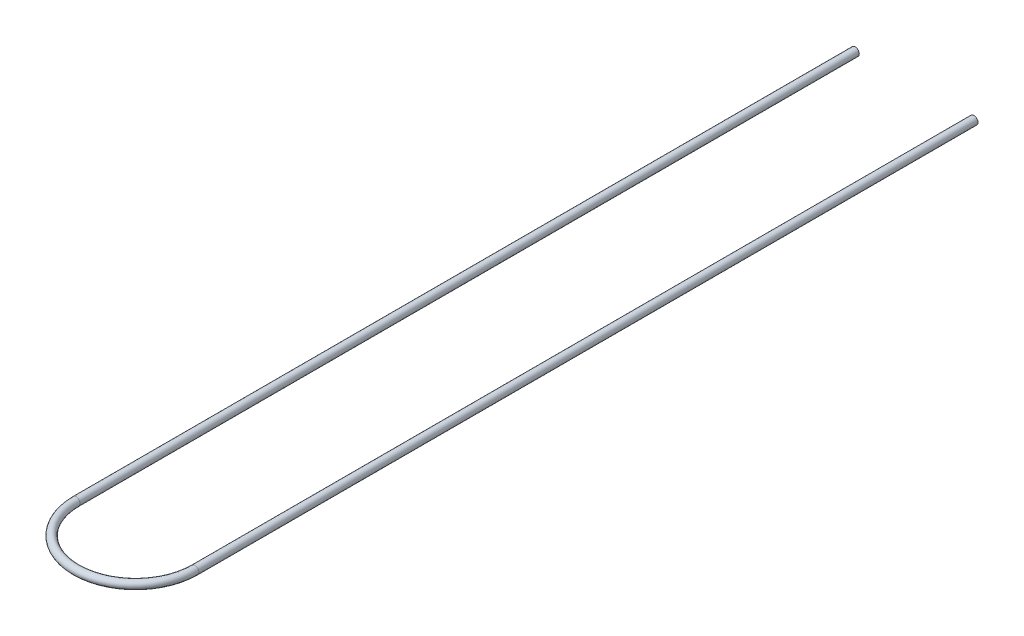
ISO-10303-21;
HEADER;
FILE_DESCRIPTION(('STEP AP214'),'2;1');
FILE_NAME('part.step','',(''),(''),'','','');
FILE_SCHEMA(('AUTOMOTIVE_DESIGN { 1 0 10303 214 1 1 1 1 }'));
ENDSEC;
DATA;
#1=APPLICATION_CONTEXT('core data for automotive mechanical design processes');
#2=APPLICATION_PROTOCOL_DEFINITION('international standard','automotive_design',2000,#1);
#3=PRODUCT_CONTEXT('',#1,'mechanical');
#4=PRODUCT('Part','Part','',(#3));
#5=PRODUCT_RELATED_PRODUCT_CATEGORY('part','',(#4));
#6=PRODUCT_DEFINITION_FORMATION('','',#4);
#7=PRODUCT_DEFINITION_CONTEXT('part definition',#1,'design');
#8=PRODUCT_DEFINITION('design','',#6,#7);
#9=PRODUCT_DEFINITION_SHAPE('','',#8);
#10=(LENGTH_UNIT() NAMED_UNIT(*) SI_UNIT(.MILLI.,.METRE.));
#11=(NAMED_UNIT(*) PLANE_ANGLE_UNIT() SI_UNIT($,.RADIAN.));
#12=(NAMED_UNIT(*) SI_UNIT($,.STERADIAN.) SOLID_ANGLE_UNIT());
#13=UNCERTAINTY_MEASURE_WITH_UNIT(LENGTH_MEASURE(1.E-05),#10,'distance_accuracy_value','');
#14=(GEOMETRIC_REPRESENTATION_CONTEXT(3) GLOBAL_UNCERTAINTY_ASSIGNED_CONTEXT((#13)) GLOBAL_UNIT_ASSIGNED_CONTEXT((#10,
#11,#12)) REPRESENTATION_CONTEXT('',''));
#15=CARTESIAN_POINT('',(0.,0.,0.));
#16=DIRECTION('',(0.,0.,1.));
#17=DIRECTION('',(1.,0.,0.));
#18=AXIS2_PLACEMENT_3D('',#15,#16,#17);
#19=CARTESIAN_POINT('',(-40.,0.,299.999999999999));
#20=DIRECTION('',(0.,0.,1.));
#21=DIRECTION('',(1.,0.,0.));
#22=AXIS2_PLACEMENT_3D('',#19,#20,#21);
#23=CYLINDRICAL_SURFACE('',#22,11.1);
#24=CARTESIAN_POINT('',(-39.9999999999997,0.,2440.));
#25=DIRECTION('',(0.,0.,1.));
#26=DIRECTION('',(1.,0.,0.));
#27=AXIS2_PLACEMENT_3D('',#24,#25,#26);
#28=CIRCLE('',#27,11.1);
#29=CARTESIAN_POINT('',(-51.0999999999998,0.,2440.));
#30=VERTEX_POINT('',#29);
#31=EDGE_CURVE('E54',#30,#30,#28,.T.);
#32=ORIENTED_EDGE('',*,*,#31,.F.);
#33=EDGE_LOOP('',(#32));
#34=FACE_BOUND('',#33,.T.);
#35=CARTESIAN_POINT('',(-40.,0.,299.999999999999));
#36=DIRECTION('',(0.,0.,1.));
#37=DIRECTION('',(1.,0.,0.));
#38=AXIS2_PLACEMENT_3D('',#35,#36,#37);
#39=CIRCLE('',#38,11.1);
#40=CARTESIAN_POINT('',(-28.9,0.,299.999999999999));
#41=VERTEX_POINT('',#40);
#42=EDGE_CURVE('E52',#41,#41,#39,.T.);
#43=ORIENTED_EDGE('',*,*,#42,.T.);
#44=EDGE_LOOP('',(#43));
#45=FACE_BOUND('',#44,.T.);
#46=ADVANCED_FACE('F31',(#34,#45),#23,.T.);
#47=CARTESIAN_POINT('',(123.08,0.,2440.));
#48=DIRECTION('',(0.,1.,0.));
#49=DIRECTION('',(0.,0.,1.));
#50=AXIS2_PLACEMENT_3D('',#47,#48,#49);
#51=TOROIDAL_SURFACE('',#50,163.08,11.1);
#52=CARTESIAN_POINT('',(286.16,0.,2440.));
#53=DIRECTION('',(0.,0.,-1.));
#54=DIRECTION('',(-1.,0.,0.));
#55=AXIS2_PLACEMENT_3D('',#52,#53,#54);
#56=CIRCLE('',#55,11.1);
#57=CARTESIAN_POINT('',(297.26,0.,2440.));
#58=VERTEX_POINT('',#57);
#59=EDGE_CURVE('E35',#58,#58,#56,.T.);
#60=CARTESIAN_POINT('',(123.08,0.,2440.));
#61=DIRECTION('',(0.,1.,0.));
#62=DIRECTION('',(0.,0.,1.));
#63=AXIS2_PLACEMENT_3D('',#60,#61,#62);
#64=CIRCLE('',#63,174.18);
#65=EDGE_CURVE('',#30,#58,#64,.T.);
#66=ORIENTED_EDGE('',*,*,#31,.T.);
#67=ORIENTED_EDGE('',*,*,#59,.F.);
#68=ORIENTED_EDGE('',*,*,#65,.T.);
#69=ORIENTED_EDGE('',*,*,#65,.F.);
#70=EDGE_LOOP('',(#66,#68,#67,#69));
#71=FACE_BOUND('',#70,.T.);
#72=ADVANCED_FACE('F62',(#71),#51,.T.);
#73=CARTESIAN_POINT('',(286.16,0.,2440.));
#74=DIRECTION('',(0.,0.,-1.));
#75=DIRECTION('',(-1.,0.,0.));
#76=AXIS2_PLACEMENT_3D('',#73,#74,#75);
#77=CYLINDRICAL_SURFACE('',#76,11.1);
#78=CARTESIAN_POINT('',(286.16,0.,299.999999999999));
#79=DIRECTION('',(0.,0.,-1.));
#80=DIRECTION('',(-1.,0.,0.));
#81=AXIS2_PLACEMENT_3D('',#78,#79,#80);
#82=CIRCLE('',#81,11.1);
#83=CARTESIAN_POINT('',(275.06,0.,299.999999999999));
#84=VERTEX_POINT('',#83);
#85=EDGE_CURVE('E48',#84,#84,#82,.T.);
#86=ORIENTED_EDGE('',*,*,#85,.F.);
#87=EDGE_LOOP('',(#86));
#88=FACE_BOUND('',#87,.T.);
#89=ORIENTED_EDGE('',*,*,#59,.T.);
#90=EDGE_LOOP('',(#89));
#91=FACE_BOUND('',#90,.T.);
#92=ADVANCED_FACE('F33',(#88,#91),#77,.T.);
#93=CARTESIAN_POINT('',(-40.,0.,299.999999999999));
#94=DIRECTION('',(0.,0.,1.));
#95=DIRECTION('',(1.,0.,0.));
#96=AXIS2_PLACEMENT_3D('',#93,#94,#95);
#97=PLANE('',#96);
#98=CARTESIAN_POINT('',(-40.,0.,299.999999999999));
#99=DIRECTION('',(0.,0.,1.));
#100=DIRECTION('',(1.,0.,0.));
#101=AXIS2_PLACEMENT_3D('',#98,#99,#100);
#102=CIRCLE('',#101,9.95000000000001);
#103=CARTESIAN_POINT('',(-30.05,0.,299.999999999999));
#104=VERTEX_POINT('',#103);
#105=EDGE_CURVE('E51',#104,#104,#102,.F.);
#106=ORIENTED_EDGE('',*,*,#105,.F.);
#107=EDGE_LOOP('',(#106));
#108=FACE_BOUND('',#107,.T.);
#109=ORIENTED_EDGE('',*,*,#42,.F.);
#110=EDGE_LOOP('',(#109));
#111=FACE_BOUND('',#110,.T.);
#112=ADVANCED_FACE('F68',(#108,#111),#97,.F.);
#113=CARTESIAN_POINT('',(286.16,0.,299.999999999999));
#114=DIRECTION('',(0.,0.,-1.));
#115=DIRECTION('',(-1.,0.,0.));
#116=AXIS2_PLACEMENT_3D('',#113,#114,#115);
#117=PLANE('',#116);
#118=CARTESIAN_POINT('',(286.16,0.,299.999999999999));
#119=DIRECTION('',(0.,0.,-1.));
#120=DIRECTION('',(-1.,0.,0.));
#121=AXIS2_PLACEMENT_3D('',#118,#119,#120);
#122=CIRCLE('',#121,9.95000000000001);
#123=CARTESIAN_POINT('',(276.21,0.,299.999999999999));
#124=VERTEX_POINT('',#123);
#125=EDGE_CURVE('E10',#124,#124,#122,.F.);
#126=ORIENTED_EDGE('',*,*,#125,.T.);
#127=EDGE_LOOP('',(#126));
#128=FACE_BOUND('',#127,.T.);
#129=ORIENTED_EDGE('',*,*,#85,.T.);
#130=EDGE_LOOP('',(#129));
#131=FACE_BOUND('',#130,.T.);
#132=ADVANCED_FACE('F86',(#128,#131),#117,.T.);
#133=CARTESIAN_POINT('',(-40.,0.,299.999999999999));
#134=DIRECTION('',(0.,0.,1.));
#135=DIRECTION('',(1.,0.,0.));
#136=AXIS2_PLACEMENT_3D('',#133,#134,#135);
#137=CYLINDRICAL_SURFACE('',#136,9.95000000000001);
#138=CARTESIAN_POINT('',(-39.9999999999997,0.,2440.));
#139=DIRECTION('',(0.,0.,1.));
#140=DIRECTION('',(1.,0.,0.));
#141=AXIS2_PLACEMENT_3D('',#138,#139,#140);
#142=CIRCLE('',#141,9.95000000000001);
#143=CARTESIAN_POINT('',(-49.9499999999997,0.,2440.));
#144=VERTEX_POINT('',#143);
#145=EDGE_CURVE('E44',#144,#144,#142,.F.);
#146=ORIENTED_EDGE('',*,*,#145,.F.);
#147=EDGE_LOOP('',(#146));
#148=FACE_BOUND('',#147,.T.);
#149=ORIENTED_EDGE('',*,*,#105,.T.);
#150=EDGE_LOOP('',(#149));
#151=FACE_BOUND('',#150,.T.);
#152=ADVANCED_FACE('F80',(#148,#151),#137,.F.);
#153=CARTESIAN_POINT('',(123.08,0.,2440.));
#154=DIRECTION('',(0.,1.,0.));
#155=DIRECTION('',(0.,0.,1.));
#156=AXIS2_PLACEMENT_3D('',#153,#154,#155);
#157=TOROIDAL_SURFACE('',#156,163.08,9.95000000000001);
#158=CARTESIAN_POINT('',(286.16,0.,2440.));
#159=DIRECTION('',(0.,0.,-1.));
#160=DIRECTION('',(-1.,0.,0.));
#161=AXIS2_PLACEMENT_3D('',#158,#159,#160);
#162=CIRCLE('',#161,9.95000000000001);
#163=CARTESIAN_POINT('',(296.11,0.,2440.));
#164=VERTEX_POINT('',#163);
#165=EDGE_CURVE('E39',#164,#164,#162,.F.);
#166=CARTESIAN_POINT('',(123.08,0.,2440.));
#167=DIRECTION('',(0.,1.,0.));
#168=DIRECTION('',(0.,0.,1.));
#169=AXIS2_PLACEMENT_3D('',#166,#167,#168);
#170=CIRCLE('',#169,173.03);
#171=EDGE_CURVE('',#144,#164,#170,.T.);
#172=ORIENTED_EDGE('',*,*,#145,.T.);
#173=ORIENTED_EDGE('',*,*,#165,.F.);
#174=ORIENTED_EDGE('',*,*,#171,.T.);
#175=ORIENTED_EDGE('',*,*,#171,.F.);
#176=EDGE_LOOP('',(#172,#174,#173,#175));
#177=FACE_BOUND('',#176,.T.);
#178=ADVANCED_FACE('F74',(#177),#157,.F.);
#179=CARTESIAN_POINT('',(286.16,0.,2440.));
#180=DIRECTION('',(0.,0.,-1.));
#181=DIRECTION('',(-1.,0.,0.));
#182=AXIS2_PLACEMENT_3D('',#179,#180,#181);
#183=CYLINDRICAL_SURFACE('',#182,9.95000000000001);
#184=ORIENTED_EDGE('',*,*,#125,.F.);
#185=EDGE_LOOP('',(#184));
#186=FACE_BOUND('',#185,.T.);
#187=ORIENTED_EDGE('',*,*,#165,.T.);
#188=EDGE_LOOP('',(#187));
#189=FACE_BOUND('',#188,.T.);
#190=ADVANCED_FACE('F72',(#186,#189),#183,.F.);
#191=CLOSED_SHELL('',(#46,#72,#92,#112,#132,#152,#178,#190));
#192=MANIFOLD_SOLID_BREP('B2',#191);
#193=ADVANCED_BREP_SHAPE_REPRESENTATION('',(#18,#192),#14);
#194=SHAPE_DEFINITION_REPRESENTATION(#9,#193);
ENDSEC;
END-ISO-10303-21;
